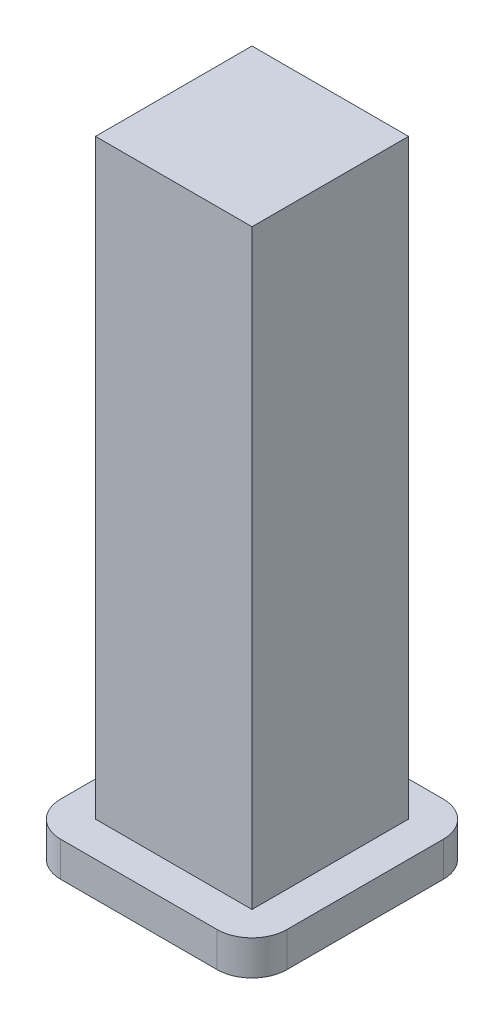
ISO-10303-21;
HEADER;
FILE_DESCRIPTION(('STEP AP214'),'2;1');
FILE_NAME('part.step','',(''),(''),'','','');
FILE_SCHEMA(('AUTOMOTIVE_DESIGN { 1 0 10303 214 1 1 1 1 }'));
ENDSEC;
DATA;
#1=APPLICATION_CONTEXT('core data for automotive mechanical design processes');
#2=APPLICATION_PROTOCOL_DEFINITION('international standard','automotive_design',2000,#1);
#3=PRODUCT_CONTEXT('',#1,'mechanical');
#4=PRODUCT('Part','Part','',(#3));
#5=PRODUCT_RELATED_PRODUCT_CATEGORY('part','',(#4));
#6=PRODUCT_DEFINITION_FORMATION('','',#4);
#7=PRODUCT_DEFINITION_CONTEXT('part definition',#1,'design');
#8=PRODUCT_DEFINITION('design','',#6,#7);
#9=PRODUCT_DEFINITION_SHAPE('','',#8);
#10=(LENGTH_UNIT() NAMED_UNIT(*) SI_UNIT(.MILLI.,.METRE.));
#11=(NAMED_UNIT(*) PLANE_ANGLE_UNIT() SI_UNIT($,.RADIAN.));
#12=(NAMED_UNIT(*) SI_UNIT($,.STERADIAN.) SOLID_ANGLE_UNIT());
#13=UNCERTAINTY_MEASURE_WITH_UNIT(LENGTH_MEASURE(1.E-05),#10,'distance_accuracy_value','');
#14=(GEOMETRIC_REPRESENTATION_CONTEXT(3) GLOBAL_UNCERTAINTY_ASSIGNED_CONTEXT((#13)) GLOBAL_UNIT_ASSIGNED_CONTEXT((#10,
#11,#12)) REPRESENTATION_CONTEXT('',''));
#15=CARTESIAN_POINT('',(0.,0.,0.));
#16=DIRECTION('',(0.,0.,1.));
#17=DIRECTION('',(1.,0.,0.));
#18=AXIS2_PLACEMENT_3D('',#15,#16,#17);
#19=CARTESIAN_POINT('',(0.,0.,45.));
#20=DIRECTION('',(1.,0.,0.));
#21=DIRECTION('',(0.,0.,-1.));
#22=AXIS2_PLACEMENT_3D('',#19,#20,#21);
#23=PLANE('',#22);
#24=DIRECTION('',(0.,-1.,0.));
#25=VECTOR('',#24,1.);
#26=CARTESIAN_POINT('',(0.,0.,0.));
#27=LINE('',#26,#25);
#28=CARTESIAN_POINT('',(0.,180.,0.));
#29=VERTEX_POINT('',#28);
#30=CARTESIAN_POINT('',(0.,10.,0.));
#31=VERTEX_POINT('',#30);
#32=EDGE_CURVE('E147',#29,#31,#27,.T.);
#33=ORIENTED_EDGE('',*,*,#32,.T.);
#34=DIRECTION('',(0.,0.,1.));
#35=VECTOR('',#34,1.);
#36=CARTESIAN_POINT('',(0.,10.,45.));
#37=LINE('',#36,#35);
#38=CARTESIAN_POINT('',(0.,10.,45.));
#39=VERTEX_POINT('',#38);
#40=EDGE_CURVE('E157',#31,#39,#37,.T.);
#41=ORIENTED_EDGE('',*,*,#40,.T.);
#42=DIRECTION('',(0.,-1.,0.));
#43=VECTOR('',#42,1.);
#44=CARTESIAN_POINT('',(0.,0.,45.));
#45=LINE('',#44,#43);
#46=CARTESIAN_POINT('',(0.,180.,45.));
#47=VERTEX_POINT('',#46);
#48=EDGE_CURVE('E247',#47,#39,#45,.T.);
#49=ORIENTED_EDGE('',*,*,#48,.F.);
#50=DIRECTION('',(0.,0.,-1.));
#51=VECTOR('',#50,1.);
#52=CARTESIAN_POINT('',(0.,180.,45.));
#53=LINE('',#52,#51);
#54=EDGE_CURVE('E170',#47,#29,#53,.T.);
#55=ORIENTED_EDGE('',*,*,#54,.T.);
#56=EDGE_LOOP('',(#33,#41,#49,#55));
#57=FACE_BOUND('',#56,.T.);
#58=ADVANCED_FACE('F45',(#57),#23,.F.);
#59=CARTESIAN_POINT('',(45.,0.,45.));
#60=DIRECTION('',(-1.,0.,0.));
#61=DIRECTION('',(0.,0.,1.));
#62=AXIS2_PLACEMENT_3D('',#59,#60,#61);
#63=PLANE('',#62);
#64=DIRECTION('',(0.,1.,0.));
#65=VECTOR('',#64,1.);
#66=CARTESIAN_POINT('',(45.,0.,45.));
#67=LINE('',#66,#65);
#68=CARTESIAN_POINT('',(45.,10.,45.));
#69=VERTEX_POINT('',#68);
#70=CARTESIAN_POINT('',(45.,180.,45.));
#71=VERTEX_POINT('',#70);
#72=EDGE_CURVE('E153',#69,#71,#67,.T.);
#73=ORIENTED_EDGE('',*,*,#72,.F.);
#74=DIRECTION('',(0.,0.,-1.));
#75=VECTOR('',#74,1.);
#76=CARTESIAN_POINT('',(45.,10.,45.));
#77=LINE('',#76,#75);
#78=CARTESIAN_POINT('',(45.,10.,0.));
#79=VERTEX_POINT('',#78);
#80=EDGE_CURVE('E151',#69,#79,#77,.T.);
#81=ORIENTED_EDGE('',*,*,#80,.T.);
#82=DIRECTION('',(0.,1.,0.));
#83=VECTOR('',#82,1.);
#84=CARTESIAN_POINT('',(45.,0.,0.));
#85=LINE('',#84,#83);
#86=CARTESIAN_POINT('',(45.,180.,0.));
#87=VERTEX_POINT('',#86);
#88=EDGE_CURVE('E135',#79,#87,#85,.T.);
#89=ORIENTED_EDGE('',*,*,#88,.T.);
#90=DIRECTION('',(0.,0.,-1.));
#91=VECTOR('',#90,1.);
#92=CARTESIAN_POINT('',(45.,180.,45.));
#93=LINE('',#92,#91);
#94=EDGE_CURVE('E164',#71,#87,#93,.T.);
#95=ORIENTED_EDGE('',*,*,#94,.F.);
#96=EDGE_LOOP('',(#73,#81,#89,#95));
#97=FACE_BOUND('',#96,.T.);
#98=ADVANCED_FACE('F152',(#97),#63,.F.);
#99=CARTESIAN_POINT('',(0.,180.,45.));
#100=DIRECTION('',(0.,-1.,0.));
#101=DIRECTION('',(0.,0.,-1.));
#102=AXIS2_PLACEMENT_3D('',#99,#100,#101);
#103=PLANE('',#102);
#104=DIRECTION('',(-1.,0.,0.));
#105=VECTOR('',#104,1.);
#106=CARTESIAN_POINT('',(0.,180.,0.));
#107=LINE('',#106,#105);
#108=EDGE_CURVE('E142',#87,#29,#107,.T.);
#109=ORIENTED_EDGE('',*,*,#108,.T.);
#110=ORIENTED_EDGE('',*,*,#54,.F.);
#111=DIRECTION('',(-1.,0.,0.));
#112=VECTOR('',#111,1.);
#113=CARTESIAN_POINT('',(0.,180.,45.));
#114=LINE('',#113,#112);
#115=EDGE_CURVE('E253',#71,#47,#114,.T.);
#116=ORIENTED_EDGE('',*,*,#115,.F.);
#117=ORIENTED_EDGE('',*,*,#94,.T.);
#118=EDGE_LOOP('',(#109,#110,#116,#117));
#119=FACE_BOUND('',#118,.T.);
#120=ADVANCED_FACE('F266',(#119),#103,.F.);
#121=CARTESIAN_POINT('',(0.,0.,45.));
#122=DIRECTION('',(0.,0.,-1.));
#123=DIRECTION('',(-1.,0.,0.));
#124=AXIS2_PLACEMENT_3D('',#121,#122,#123);
#125=PLANE('',#124);
#126=ORIENTED_EDGE('',*,*,#48,.T.);
#127=DIRECTION('',(1.,0.,0.));
#128=VECTOR('',#127,1.);
#129=CARTESIAN_POINT('',(0.,10.,45.));
#130=LINE('',#129,#128);
#131=EDGE_CURVE('E244',#39,#69,#130,.T.);
#132=ORIENTED_EDGE('',*,*,#131,.T.);
#133=ORIENTED_EDGE('',*,*,#72,.T.);
#134=ORIENTED_EDGE('',*,*,#115,.T.);
#135=EDGE_LOOP('',(#126,#132,#133,#134));
#136=FACE_BOUND('',#135,.T.);
#137=ADVANCED_FACE('F268',(#136),#125,.F.);
#138=CARTESIAN_POINT('',(0.,0.,0.));
#139=DIRECTION('',(0.,0.,-1.));
#140=DIRECTION('',(-1.,0.,0.));
#141=AXIS2_PLACEMENT_3D('',#138,#139,#140);
#142=PLANE('',#141);
#143=DIRECTION('',(1.,0.,0.));
#144=VECTOR('',#143,1.);
#145=CARTESIAN_POINT('',(0.,10.,0.));
#146=LINE('',#145,#144);
#147=EDGE_CURVE('E140',#31,#79,#146,.T.);
#148=ORIENTED_EDGE('',*,*,#147,.F.);
#149=ORIENTED_EDGE('',*,*,#32,.F.);
#150=ORIENTED_EDGE('',*,*,#108,.F.);
#151=ORIENTED_EDGE('',*,*,#88,.F.);
#152=EDGE_LOOP('',(#148,#149,#150,#151));
#153=FACE_BOUND('',#152,.T.);
#154=ADVANCED_FACE('F137',(#153),#142,.T.);
#155=CARTESIAN_POINT('',(0.,10.,0.));
#156=DIRECTION('',(0.,1.,0.));
#157=DIRECTION('',(0.,0.,1.));
#158=AXIS2_PLACEMENT_3D('',#155,#156,#157);
#159=PLANE('',#158);
#160=DIRECTION('',(0.,0.,-1.));
#161=VECTOR('',#160,1.);
#162=CARTESIAN_POINT('',(-10.,10.,-10.));
#163=LINE('',#162,#161);
#164=CARTESIAN_POINT('',(-10.,10.,45.));
#165=VERTEX_POINT('',#164);
#166=CARTESIAN_POINT('',(-10.,10.,0.));
#167=VERTEX_POINT('',#166);
#168=EDGE_CURVE('E236',#165,#167,#163,.T.);
#169=ORIENTED_EDGE('',*,*,#168,.F.);
#170=CARTESIAN_POINT('',(0.,10.,45.));
#171=DIRECTION('',(0.,1.,0.));
#172=DIRECTION('',(0.,0.,1.));
#173=AXIS2_PLACEMENT_3D('',#170,#171,#172);
#174=CIRCLE('',#173,10.);
#175=CARTESIAN_POINT('',(0.,10.,55.));
#176=VERTEX_POINT('',#175);
#177=EDGE_CURVE('E204',#165,#176,#174,.T.);
#178=ORIENTED_EDGE('',*,*,#177,.T.);
#179=DIRECTION('',(-1.,0.,0.));
#180=VECTOR('',#179,1.);
#181=CARTESIAN_POINT('',(-10.,10.,55.));
#182=LINE('',#181,#180);
#183=CARTESIAN_POINT('',(45.,10.,55.));
#184=VERTEX_POINT('',#183);
#185=EDGE_CURVE('E158',#184,#176,#182,.T.);
#186=ORIENTED_EDGE('',*,*,#185,.F.);
#187=CARTESIAN_POINT('',(45.,10.,45.));
#188=DIRECTION('',(0.,1.,0.));
#189=DIRECTION('',(0.,0.,1.));
#190=AXIS2_PLACEMENT_3D('',#187,#188,#189);
#191=CIRCLE('',#190,10.);
#192=CARTESIAN_POINT('',(55.,10.,45.));
#193=VERTEX_POINT('',#192);
#194=EDGE_CURVE('E201',#184,#193,#191,.T.);
#195=ORIENTED_EDGE('',*,*,#194,.T.);
#196=DIRECTION('',(0.,0.,1.));
#197=VECTOR('',#196,1.);
#198=CARTESIAN_POINT('',(55.,10.,-10.));
#199=LINE('',#198,#197);
#200=CARTESIAN_POINT('',(55.,10.,0.));
#201=VERTEX_POINT('',#200);
#202=EDGE_CURVE('E222',#201,#193,#199,.T.);
#203=ORIENTED_EDGE('',*,*,#202,.F.);
#204=CARTESIAN_POINT('',(45.,10.,0.));
#205=DIRECTION('',(0.,1.,0.));
#206=DIRECTION('',(0.,0.,1.));
#207=AXIS2_PLACEMENT_3D('',#204,#205,#206);
#208=CIRCLE('',#207,10.);
#209=CARTESIAN_POINT('',(45.,10.,-10.));
#210=VERTEX_POINT('',#209);
#211=EDGE_CURVE('E61',#201,#210,#208,.T.);
#212=ORIENTED_EDGE('',*,*,#211,.T.);
#213=DIRECTION('',(1.,0.,0.));
#214=VECTOR('',#213,1.);
#215=CARTESIAN_POINT('',(-10.,10.,-10.));
#216=LINE('',#215,#214);
#217=CARTESIAN_POINT('',(0.,10.,-10.));
#218=VERTEX_POINT('',#217);
#219=EDGE_CURVE('E301',#218,#210,#216,.T.);
#220=ORIENTED_EDGE('',*,*,#219,.F.);
#221=CARTESIAN_POINT('',(0.,10.,0.));
#222=DIRECTION('',(0.,1.,0.));
#223=DIRECTION('',(0.,0.,1.));
#224=AXIS2_PLACEMENT_3D('',#221,#222,#223);
#225=CIRCLE('',#224,10.);
#226=EDGE_CURVE('E196',#218,#167,#225,.T.);
#227=ORIENTED_EDGE('',*,*,#226,.T.);
#228=EDGE_LOOP('',(#169,#178,#186,#195,#203,#212,#220,#227));
#229=FACE_BOUND('',#228,.T.);
#230=ORIENTED_EDGE('',*,*,#131,.F.);
#231=ORIENTED_EDGE('',*,*,#40,.F.);
#232=ORIENTED_EDGE('',*,*,#147,.T.);
#233=ORIENTED_EDGE('',*,*,#80,.F.);
#234=EDGE_LOOP('',(#230,#231,#232,#233));
#235=FACE_BOUND('',#234,.T.);
#236=ADVANCED_FACE('F161',(#229,#235),#159,.T.);
#237=CARTESIAN_POINT('',(-10.,10.,-10.));
#238=DIRECTION('',(-1.,0.,0.));
#239=DIRECTION('',(0.,0.,1.));
#240=AXIS2_PLACEMENT_3D('',#237,#238,#239);
#241=PLANE('',#240);
#242=DIRECTION('',(0.,0.,-1.));
#243=VECTOR('',#242,1.);
#244=CARTESIAN_POINT('',(-10.,0.,-10.));
#245=LINE('',#244,#243);
#246=CARTESIAN_POINT('',(-10.,0.,45.));
#247=VERTEX_POINT('',#246);
#248=CARTESIAN_POINT('',(-10.,0.,0.));
#249=VERTEX_POINT('',#248);
#250=EDGE_CURVE('E238',#247,#249,#245,.T.);
#251=ORIENTED_EDGE('',*,*,#250,.F.);
#252=DIRECTION('',(0.,-1.,0.));
#253=VECTOR('',#252,1.);
#254=CARTESIAN_POINT('',(-10.,10.,45.));
#255=LINE('',#254,#253);
#256=EDGE_CURVE('E193',#247,#165,#255,.F.);
#257=ORIENTED_EDGE('',*,*,#256,.T.);
#258=ORIENTED_EDGE('',*,*,#168,.T.);
#259=DIRECTION('',(0.,-1.,0.));
#260=VECTOR('',#259,1.);
#261=CARTESIAN_POINT('',(-10.,10.,0.));
#262=LINE('',#261,#260);
#263=EDGE_CURVE('E189',#167,#249,#262,.T.);
#264=ORIENTED_EDGE('',*,*,#263,.T.);
#265=EDGE_LOOP('',(#251,#257,#258,#264));
#266=FACE_BOUND('',#265,.T.);
#267=ADVANCED_FACE('F308',(#266),#241,.T.);
#268=CARTESIAN_POINT('',(-10.,10.,55.));
#269=DIRECTION('',(0.,0.,1.));
#270=DIRECTION('',(1.,0.,0.));
#271=AXIS2_PLACEMENT_3D('',#268,#269,#270);
#272=PLANE('',#271);
#273=ORIENTED_EDGE('',*,*,#185,.T.);
#274=DIRECTION('',(0.,-1.,0.));
#275=VECTOR('',#274,1.);
#276=CARTESIAN_POINT('',(0.,10.,55.));
#277=LINE('',#276,#275);
#278=CARTESIAN_POINT('',(0.,0.,55.));
#279=VERTEX_POINT('',#278);
#280=EDGE_CURVE('E168',#176,#279,#277,.T.);
#281=ORIENTED_EDGE('',*,*,#280,.T.);
#282=DIRECTION('',(-1.,0.,0.));
#283=VECTOR('',#282,1.);
#284=CARTESIAN_POINT('',(-10.,0.,55.));
#285=LINE('',#284,#283);
#286=CARTESIAN_POINT('',(45.,0.,55.));
#287=VERTEX_POINT('',#286);
#288=EDGE_CURVE('E231',#287,#279,#285,.T.);
#289=ORIENTED_EDGE('',*,*,#288,.F.);
#290=DIRECTION('',(0.,-1.,0.));
#291=VECTOR('',#290,1.);
#292=CARTESIAN_POINT('',(45.,10.,55.));
#293=LINE('',#292,#291);
#294=EDGE_CURVE('E163',#287,#184,#293,.F.);
#295=ORIENTED_EDGE('',*,*,#294,.T.);
#296=EDGE_LOOP('',(#273,#281,#289,#295));
#297=FACE_BOUND('',#296,.T.);
#298=ADVANCED_FACE('F325',(#297),#272,.T.);
#299=CARTESIAN_POINT('',(55.,10.,-10.));
#300=DIRECTION('',(1.,0.,0.));
#301=DIRECTION('',(0.,0.,-1.));
#302=AXIS2_PLACEMENT_3D('',#299,#300,#301);
#303=PLANE('',#302);
#304=ORIENTED_EDGE('',*,*,#202,.T.);
#305=DIRECTION('',(0.,-1.,0.));
#306=VECTOR('',#305,1.);
#307=CARTESIAN_POINT('',(55.,10.,45.));
#308=LINE('',#307,#306);
#309=CARTESIAN_POINT('',(55.,0.,45.));
#310=VERTEX_POINT('',#309);
#311=EDGE_CURVE('E210',#193,#310,#308,.T.);
#312=ORIENTED_EDGE('',*,*,#311,.T.);
#313=DIRECTION('',(0.,0.,1.));
#314=VECTOR('',#313,1.);
#315=CARTESIAN_POINT('',(55.,0.,-10.));
#316=LINE('',#315,#314);
#317=CARTESIAN_POINT('',(55.,0.,0.));
#318=VERTEX_POINT('',#317);
#319=EDGE_CURVE('E220',#318,#310,#316,.T.);
#320=ORIENTED_EDGE('',*,*,#319,.F.);
#321=DIRECTION('',(0.,-1.,0.));
#322=VECTOR('',#321,1.);
#323=CARTESIAN_POINT('',(55.,10.,0.));
#324=LINE('',#323,#322);
#325=EDGE_CURVE('E207',#318,#201,#324,.F.);
#326=ORIENTED_EDGE('',*,*,#325,.T.);
#327=EDGE_LOOP('',(#304,#312,#320,#326));
#328=FACE_BOUND('',#327,.T.);
#329=ADVANCED_FACE('F219',(#328),#303,.T.);
#330=CARTESIAN_POINT('',(-10.,10.,-10.));
#331=DIRECTION('',(0.,0.,-1.));
#332=DIRECTION('',(-1.,0.,0.));
#333=AXIS2_PLACEMENT_3D('',#330,#331,#332);
#334=PLANE('',#333);
#335=ORIENTED_EDGE('',*,*,#219,.T.);
#336=DIRECTION('',(0.,-1.,0.));
#337=VECTOR('',#336,1.);
#338=CARTESIAN_POINT('',(45.,10.,-10.));
#339=LINE('',#338,#337);
#340=CARTESIAN_POINT('',(45.,0.,-10.));
#341=VERTEX_POINT('',#340);
#342=EDGE_CURVE('E11',#210,#341,#339,.T.);
#343=ORIENTED_EDGE('',*,*,#342,.T.);
#344=DIRECTION('',(1.,0.,0.));
#345=VECTOR('',#344,1.);
#346=CARTESIAN_POINT('',(-10.,0.,-10.));
#347=LINE('',#346,#345);
#348=CARTESIAN_POINT('',(0.,0.,-10.));
#349=VERTEX_POINT('',#348);
#350=EDGE_CURVE('E232',#349,#341,#347,.T.);
#351=ORIENTED_EDGE('',*,*,#350,.F.);
#352=DIRECTION('',(0.,-1.,0.));
#353=VECTOR('',#352,1.);
#354=CARTESIAN_POINT('',(0.,10.,-10.));
#355=LINE('',#354,#353);
#356=EDGE_CURVE('E54',#349,#218,#355,.F.);
#357=ORIENTED_EDGE('',*,*,#356,.T.);
#358=EDGE_LOOP('',(#335,#343,#351,#357));
#359=FACE_BOUND('',#358,.T.);
#360=ADVANCED_FACE('F300',(#359),#334,.T.);
#361=CARTESIAN_POINT('',(0.,0.,45.));
#362=DIRECTION('',(0.,1.,0.));
#363=DIRECTION('',(0.,0.,1.));
#364=AXIS2_PLACEMENT_3D('',#361,#362,#363);
#365=PLANE('',#364);
#366=ORIENTED_EDGE('',*,*,#288,.T.);
#367=CARTESIAN_POINT('',(0.,0.,45.));
#368=DIRECTION('',(0.,1.,0.));
#369=DIRECTION('',(0.,0.,1.));
#370=AXIS2_PLACEMENT_3D('',#367,#368,#369);
#371=CIRCLE('',#370,10.);
#372=EDGE_CURVE('E186',#279,#247,#371,.F.);
#373=ORIENTED_EDGE('',*,*,#372,.T.);
#374=ORIENTED_EDGE('',*,*,#250,.T.);
#375=CARTESIAN_POINT('',(0.,0.,0.));
#376=DIRECTION('',(0.,1.,0.));
#377=DIRECTION('',(0.,0.,1.));
#378=AXIS2_PLACEMENT_3D('',#375,#376,#377);
#379=CIRCLE('',#378,10.);
#380=EDGE_CURVE('E177',#249,#349,#379,.F.);
#381=ORIENTED_EDGE('',*,*,#380,.T.);
#382=ORIENTED_EDGE('',*,*,#350,.T.);
#383=CARTESIAN_POINT('',(45.,0.,0.));
#384=DIRECTION('',(0.,1.,0.));
#385=DIRECTION('',(0.,0.,1.));
#386=AXIS2_PLACEMENT_3D('',#383,#384,#385);
#387=CIRCLE('',#386,10.);
#388=EDGE_CURVE('E180',#341,#318,#387,.F.);
#389=ORIENTED_EDGE('',*,*,#388,.T.);
#390=ORIENTED_EDGE('',*,*,#319,.T.);
#391=CARTESIAN_POINT('',(45.,0.,45.));
#392=DIRECTION('',(0.,1.,0.));
#393=DIRECTION('',(0.,0.,1.));
#394=AXIS2_PLACEMENT_3D('',#391,#392,#393);
#395=CIRCLE('',#394,10.);
#396=EDGE_CURVE('E183',#310,#287,#395,.F.);
#397=ORIENTED_EDGE('',*,*,#396,.T.);
#398=EDGE_LOOP('',(#366,#373,#374,#381,#382,#389,#390,#397));
#399=FACE_BOUND('',#398,.T.);
#400=ADVANCED_FACE('F227',(#399),#365,.F.);
#401=CARTESIAN_POINT('',(0.,10.,45.));
#402=DIRECTION('',(0.,-1.,0.));
#403=DIRECTION('',(0.,0.,-1.));
#404=AXIS2_PLACEMENT_3D('',#401,#402,#403);
#405=CYLINDRICAL_SURFACE('',#404,10.);
#406=ORIENTED_EDGE('',*,*,#177,.F.);
#407=ORIENTED_EDGE('',*,*,#256,.F.);
#408=ORIENTED_EDGE('',*,*,#372,.F.);
#409=ORIENTED_EDGE('',*,*,#280,.F.);
#410=EDGE_LOOP('',(#406,#407,#408,#409));
#411=FACE_BOUND('',#410,.T.);
#412=ADVANCED_FACE('F286',(#411),#405,.T.);
#413=CARTESIAN_POINT('',(45.,10.,45.));
#414=DIRECTION('',(0.,-1.,0.));
#415=DIRECTION('',(0.,0.,-1.));
#416=AXIS2_PLACEMENT_3D('',#413,#414,#415);
#417=CYLINDRICAL_SURFACE('',#416,10.);
#418=ORIENTED_EDGE('',*,*,#194,.F.);
#419=ORIENTED_EDGE('',*,*,#294,.F.);
#420=ORIENTED_EDGE('',*,*,#396,.F.);
#421=ORIENTED_EDGE('',*,*,#311,.F.);
#422=EDGE_LOOP('',(#418,#419,#420,#421));
#423=FACE_BOUND('',#422,.T.);
#424=ADVANCED_FACE('F289',(#423),#417,.T.);
#425=CARTESIAN_POINT('',(45.,10.,0.));
#426=DIRECTION('',(0.,-1.,0.));
#427=DIRECTION('',(0.,0.,-1.));
#428=AXIS2_PLACEMENT_3D('',#425,#426,#427);
#429=CYLINDRICAL_SURFACE('',#428,10.);
#430=ORIENTED_EDGE('',*,*,#211,.F.);
#431=ORIENTED_EDGE('',*,*,#325,.F.);
#432=ORIENTED_EDGE('',*,*,#388,.F.);
#433=ORIENTED_EDGE('',*,*,#342,.F.);
#434=EDGE_LOOP('',(#430,#431,#432,#433));
#435=FACE_BOUND('',#434,.T.);
#436=ADVANCED_FACE('F292',(#435),#429,.T.);
#437=CARTESIAN_POINT('',(0.,10.,0.));
#438=DIRECTION('',(0.,-1.,0.));
#439=DIRECTION('',(0.,0.,-1.));
#440=AXIS2_PLACEMENT_3D('',#437,#438,#439);
#441=CYLINDRICAL_SURFACE('',#440,10.);
#442=ORIENTED_EDGE('',*,*,#226,.F.);
#443=ORIENTED_EDGE('',*,*,#356,.F.);
#444=ORIENTED_EDGE('',*,*,#380,.F.);
#445=ORIENTED_EDGE('',*,*,#263,.F.);
#446=EDGE_LOOP('',(#442,#443,#444,#445));
#447=FACE_BOUND('',#446,.T.);
#448=ADVANCED_FACE('F47',(#447),#441,.T.);
#449=CLOSED_SHELL('',(#58,#98,#120,#137,#154,#236,#267,#298,#329,#360,#400,#412,#424,#436,#448));
#450=MANIFOLD_SOLID_BREP('B2',#449);
#451=ADVANCED_BREP_SHAPE_REPRESENTATION('',(#18,#450),#14);
#452=SHAPE_DEFINITION_REPRESENTATION(#9,#451);
ENDSEC;
END-ISO-10303-21;
